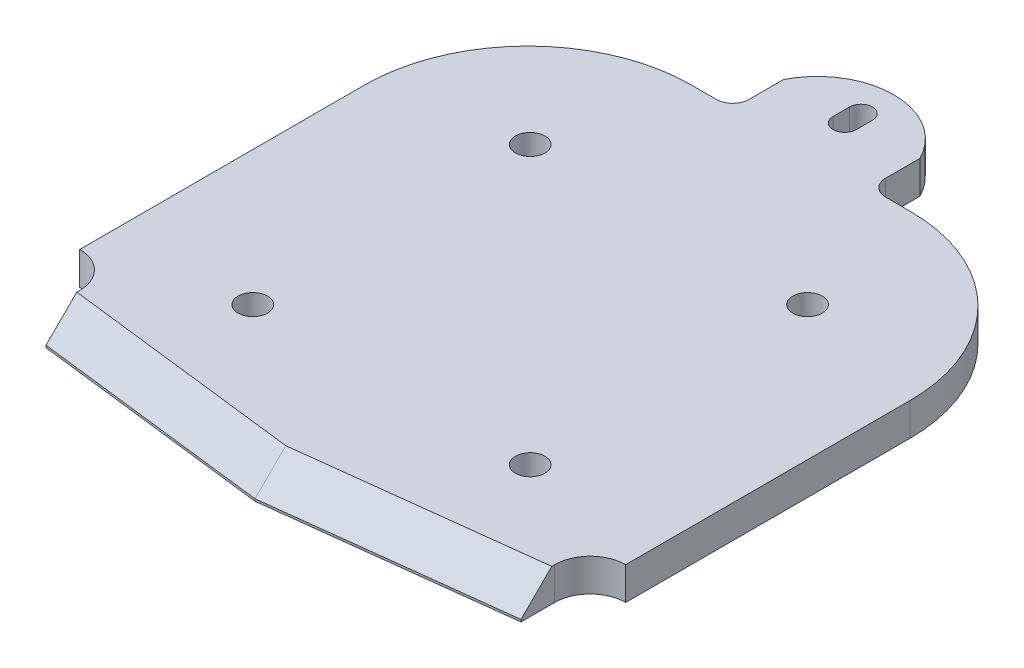
ISO-10303-21;
HEADER;
FILE_DESCRIPTION(('STEP AP214'),'2;1');
FILE_NAME('part.step','',(''),(''),'','','');
FILE_SCHEMA(('AUTOMOTIVE_DESIGN { 1 0 10303 214 1 1 1 1 }'));
ENDSEC;
DATA;
#1=APPLICATION_CONTEXT('core data for automotive mechanical design processes');
#2=APPLICATION_PROTOCOL_DEFINITION('international standard','automotive_design',2000,#1);
#3=PRODUCT_CONTEXT('',#1,'mechanical');
#4=PRODUCT('Part','Part','',(#3));
#5=PRODUCT_RELATED_PRODUCT_CATEGORY('part','',(#4));
#6=PRODUCT_DEFINITION_FORMATION('','',#4);
#7=PRODUCT_DEFINITION_CONTEXT('part definition',#1,'design');
#8=PRODUCT_DEFINITION('design','',#6,#7);
#9=PRODUCT_DEFINITION_SHAPE('','',#8);
#10=(LENGTH_UNIT() NAMED_UNIT(*) SI_UNIT(.MILLI.,.METRE.));
#11=(NAMED_UNIT(*) PLANE_ANGLE_UNIT() SI_UNIT($,.RADIAN.));
#12=(NAMED_UNIT(*) SI_UNIT($,.STERADIAN.) SOLID_ANGLE_UNIT());
#13=UNCERTAINTY_MEASURE_WITH_UNIT(LENGTH_MEASURE(1.E-05),#10,'distance_accuracy_value','');
#14=(GEOMETRIC_REPRESENTATION_CONTEXT(3) GLOBAL_UNCERTAINTY_ASSIGNED_CONTEXT((#13)) GLOBAL_UNIT_ASSIGNED_CONTEXT((#10,
#11,#12)) REPRESENTATION_CONTEXT('',''));
#15=CARTESIAN_POINT('',(0.,0.,0.));
#16=DIRECTION('',(0.,0.,1.));
#17=DIRECTION('',(1.,0.,0.));
#18=AXIS2_PLACEMENT_3D('',#15,#16,#17);
#19=CARTESIAN_POINT('',(0.,6.,0.));
#20=DIRECTION('',(0.119183844208202,0.,0.992872202894086));
#21=DIRECTION('',(0.992872202894086,0.,-0.119183844208202));
#22=AXIS2_PLACEMENT_3D('',#19,#20,#21);
#23=PLANE('',#22);
#24=DIRECTION('',(0.,-1.,0.));
#25=VECTOR('',#24,1.);
#26=CARTESIAN_POINT('',(43.4999999999999,6.,-5.22171655923559));
#27=LINE('',#26,#25);
#28=CARTESIAN_POINT('',(43.4999999999999,0.400000130739457,-5.22171655923559));
#29=VERTEX_POINT('',#28);
#30=CARTESIAN_POINT('',(43.4999999999999,0.,-5.22171655923559));
#31=VERTEX_POINT('',#30);
#32=EDGE_CURVE('E291',#29,#31,#27,.T.);
#33=ORIENTED_EDGE('',*,*,#32,.F.);
#34=DIRECTION('',(-0.992872202894086,0.,0.119183844208202));
#35=VECTOR('',#34,1.);
#36=CARTESIAN_POINT('',(63.1359808294858,0.400000130739457,-7.57880911680247));
#37=LINE('',#36,#35);
#38=CARTESIAN_POINT('',(0.,0.400000130739457,0.));
#39=VERTEX_POINT('',#38);
#40=EDGE_CURVE('E495',#29,#39,#37,.T.);
#41=ORIENTED_EDGE('',*,*,#40,.T.);
#42=DIRECTION('',(0.,-1.,0.));
#43=VECTOR('',#42,1.);
#44=CARTESIAN_POINT('',(0.,6.,0.));
#45=LINE('',#44,#43);
#46=CARTESIAN_POINT('',(0.,0.,0.));
#47=VERTEX_POINT('',#46);
#48=EDGE_CURVE('E293',#39,#47,#45,.T.);
#49=ORIENTED_EDGE('',*,*,#48,.T.);
#50=DIRECTION('',(-0.992872202894086,0.,0.119183844208202));
#51=VECTOR('',#50,1.);
#52=CARTESIAN_POINT('',(0.,0.,0.));
#53=LINE('',#52,#51);
#54=EDGE_CURVE('E229',#31,#47,#53,.T.);
#55=ORIENTED_EDGE('',*,*,#54,.F.);
#56=EDGE_LOOP('',(#33,#41,#49,#55));
#57=FACE_BOUND('',#56,.T.);
#58=ADVANCED_FACE('F34',(#57),#23,.T.);
#59=CARTESIAN_POINT('',(43.4999999999999,6.,0.));
#60=DIRECTION('',(1.,0.,0.));
#61=DIRECTION('',(0.,0.,-1.));
#62=AXIS2_PLACEMENT_3D('',#59,#60,#61);
#63=PLANE('',#62);
#64=DIRECTION('',(0.,0.,1.));
#65=VECTOR('',#64,1.);
#66=CARTESIAN_POINT('',(43.4999999999999,6.,0.));
#67=LINE('',#66,#65);
#68=CARTESIAN_POINT('',(43.4999999999999,6.,-11.4));
#69=VERTEX_POINT('',#68);
#70=CARTESIAN_POINT('',(43.4999999999999,6.,-10.861916801427));
#71=VERTEX_POINT('',#70);
#72=EDGE_CURVE('E329',#69,#71,#67,.T.);
#73=ORIENTED_EDGE('',*,*,#72,.T.);
#74=DIRECTION('',(0.,0.704573320376603,-0.709631197322587));
#75=VECTOR('',#74,1.);
#76=CARTESIAN_POINT('',(43.4999999999999,7.17851612907205,-12.0488930713918));
#77=LINE('',#76,#75);
#78=EDGE_CURVE('E212',#29,#71,#77,.T.);
#79=ORIENTED_EDGE('',*,*,#78,.F.);
#80=ORIENTED_EDGE('',*,*,#32,.T.);
#81=DIRECTION('',(0.,0.,1.));
#82=VECTOR('',#81,1.);
#83=CARTESIAN_POINT('',(43.4999999999999,0.,0.));
#84=LINE('',#83,#82);
#85=CARTESIAN_POINT('',(43.4999999999999,0.,-11.4));
#86=VERTEX_POINT('',#85);
#87=EDGE_CURVE('E232',#86,#31,#84,.T.);
#88=ORIENTED_EDGE('',*,*,#87,.F.);
#89=DIRECTION('',(0.,-1.,0.));
#90=VECTOR('',#89,1.);
#91=CARTESIAN_POINT('',(43.4999999999999,6.,-11.4));
#92=LINE('',#91,#90);
#93=EDGE_CURVE('E289',#69,#86,#92,.T.);
#94=ORIENTED_EDGE('',*,*,#93,.F.);
#95=EDGE_LOOP('',(#73,#79,#80,#88,#94));
#96=FACE_BOUND('',#95,.T.);
#97=ADVANCED_FACE('F371',(#96),#63,.T.);
#98=CARTESIAN_POINT('',(0.,6.,0.));
#99=DIRECTION('',(0.,1.,0.));
#100=DIRECTION('',(0.,0.,1.));
#101=AXIS2_PLACEMENT_3D('',#98,#99,#100);
#102=PLANE('',#101);
#103=CARTESIAN_POINT('',(-25.4,6.,-75.8));
#104=DIRECTION('',(0.,1.,0.));
#105=DIRECTION('',(0.,0.,1.));
#106=AXIS2_PLACEMENT_3D('',#103,#104,#105);
#107=CIRCLE('',#106,2.7051);
#108=CARTESIAN_POINT('',(-25.4,6.,-73.0949));
#109=VERTEX_POINT('',#108);
#110=EDGE_CURVE('E516',#109,#109,#107,.T.);
#111=ORIENTED_EDGE('',*,*,#110,.F.);
#112=EDGE_LOOP('',(#111));
#113=FACE_BOUND('',#112,.T.);
#114=CARTESIAN_POINT('',(25.4,6.,-75.8));
#115=DIRECTION('',(0.,1.,0.));
#116=DIRECTION('',(0.,0.,1.));
#117=AXIS2_PLACEMENT_3D('',#114,#115,#116);
#118=CIRCLE('',#117,2.7051);
#119=CARTESIAN_POINT('',(25.4,6.,-73.0949));
#120=VERTEX_POINT('',#119);
#121=EDGE_CURVE('E520',#120,#120,#118,.T.);
#122=ORIENTED_EDGE('',*,*,#121,.F.);
#123=EDGE_LOOP('',(#122));
#124=FACE_BOUND('',#123,.T.);
#125=CARTESIAN_POINT('',(25.4,6.,-25.));
#126=DIRECTION('',(0.,1.,0.));
#127=DIRECTION('',(0.,0.,1.));
#128=AXIS2_PLACEMENT_3D('',#125,#126,#127);
#129=CIRCLE('',#128,2.7051);
#130=CARTESIAN_POINT('',(25.4,6.,-22.2949));
#131=VERTEX_POINT('',#130);
#132=EDGE_CURVE('E524',#131,#131,#129,.T.);
#133=ORIENTED_EDGE('',*,*,#132,.F.);
#134=EDGE_LOOP('',(#133));
#135=FACE_BOUND('',#134,.T.);
#136=CARTESIAN_POINT('',(-25.4,6.,-25.));
#137=DIRECTION('',(0.,1.,0.));
#138=DIRECTION('',(0.,0.,1.));
#139=AXIS2_PLACEMENT_3D('',#136,#137,#138);
#140=CIRCLE('',#139,2.7051);
#141=CARTESIAN_POINT('',(-25.4,6.,-22.2949));
#142=VERTEX_POINT('',#141);
#143=EDGE_CURVE('E527',#142,#142,#140,.T.);
#144=ORIENTED_EDGE('',*,*,#143,.F.);
#145=EDGE_LOOP('',(#144));
#146=FACE_BOUND('',#145,.T.);
#147=DIRECTION('',(0.992872202894086,0.,0.119183844208201));
#148=VECTOR('',#147,1.);
#149=CARTESIAN_POINT('',(-63.1359808294858,6.,-13.2190093589938));
#150=LINE('',#149,#148);
#151=CARTESIAN_POINT('',(-43.5,6.,-10.8619168014269));
#152=VERTEX_POINT('',#151);
#153=CARTESIAN_POINT('',(0.,6.,-5.64020024219136));
#154=VERTEX_POINT('',#153);
#155=EDGE_CURVE('E472',#152,#154,#150,.T.);
#156=ORIENTED_EDGE('',*,*,#155,.T.);
#157=DIRECTION('',(-0.992872202894086,0.,0.119183844208202));
#158=VECTOR('',#157,1.);
#159=CARTESIAN_POINT('',(63.1359808294858,6.,-13.2190093589938));
#160=LINE('',#159,#158);
#161=EDGE_CURVE('E454',#71,#154,#160,.T.);
#162=ORIENTED_EDGE('',*,*,#161,.F.);
#163=ORIENTED_EDGE('',*,*,#72,.F.);
#164=CARTESIAN_POINT('',(50.,6.,-11.4));
#165=DIRECTION('',(0.,1.,0.));
#166=DIRECTION('',(0.,0.,1.));
#167=AXIS2_PLACEMENT_3D('',#164,#165,#166);
#168=CIRCLE('',#167,6.5000000000001);
#169=CARTESIAN_POINT('',(50.,6.,-17.9000000000001));
#170=VERTEX_POINT('',#169);
#171=EDGE_CURVE('E332',#170,#69,#168,.T.);
#172=ORIENTED_EDGE('',*,*,#171,.F.);
#173=DIRECTION('',(0.,0.,1.));
#174=VECTOR('',#173,1.);
#175=CARTESIAN_POINT('',(50.,6.,0.));
#176=LINE('',#175,#174);
#177=CARTESIAN_POINT('',(50.,6.,-70.));
#178=VERTEX_POINT('',#177);
#179=EDGE_CURVE('E335',#178,#170,#176,.T.);
#180=ORIENTED_EDGE('',*,*,#179,.F.);
#181=CARTESIAN_POINT('',(20.,6.,-70.));
#182=DIRECTION('',(0.,1.,0.));
#183=DIRECTION('',(0.,0.,1.));
#184=AXIS2_PLACEMENT_3D('',#181,#182,#183);
#185=CIRCLE('',#184,30.);
#186=CARTESIAN_POINT('',(20.,6.,-100.));
#187=VERTEX_POINT('',#186);
#188=EDGE_CURVE('E338',#178,#187,#185,.T.);
#189=ORIENTED_EDGE('',*,*,#188,.T.);
#190=DIRECTION('',(1.,0.,0.));
#191=VECTOR('',#190,1.);
#192=CARTESIAN_POINT('',(-3.08395284618099E-13,6.,-100.));
#193=LINE('',#192,#191);
#194=CARTESIAN_POINT('',(15.5,6.,-100.));
#195=VERTEX_POINT('',#194);
#196=EDGE_CURVE('E340',#195,#187,#193,.T.);
#197=ORIENTED_EDGE('',*,*,#196,.F.);
#198=CARTESIAN_POINT('',(15.5,6.,-103.));
#199=DIRECTION('',(0.,1.,0.));
#200=DIRECTION('',(0.,0.,1.));
#201=AXIS2_PLACEMENT_3D('',#198,#199,#200);
#202=CIRCLE('',#201,3.);
#203=CARTESIAN_POINT('',(12.5,6.,-103.));
#204=VERTEX_POINT('',#203);
#205=EDGE_CURVE('E343',#204,#195,#202,.T.);
#206=ORIENTED_EDGE('',*,*,#205,.F.);
#207=DIRECTION('',(0.,0.,-1.));
#208=VECTOR('',#207,1.);
#209=CARTESIAN_POINT('',(12.5000000000001,6.,0.));
#210=LINE('',#209,#208);
#211=CARTESIAN_POINT('',(12.5,6.,-109.304760106459));
#212=VERTEX_POINT('',#211);
#213=EDGE_CURVE('E346',#204,#212,#210,.T.);
#214=ORIENTED_EDGE('',*,*,#213,.T.);
#215=CARTESIAN_POINT('',(0.,6.,-103.));
#216=DIRECTION('',(0.,1.,0.));
#217=DIRECTION('',(0.,0.,1.));
#218=AXIS2_PLACEMENT_3D('',#215,#216,#217);
#219=CIRCLE('',#218,14.);
#220=CARTESIAN_POINT('',(-12.5,6.,-109.304760106459));
#221=VERTEX_POINT('',#220);
#222=EDGE_CURVE('E349',#212,#221,#219,.T.);
#223=ORIENTED_EDGE('',*,*,#222,.T.);
#224=DIRECTION('',(0.,0.,-1.));
#225=VECTOR('',#224,1.);
#226=CARTESIAN_POINT('',(-12.5,6.,0.));
#227=LINE('',#226,#225);
#228=CARTESIAN_POINT('',(-12.5,6.,-103.));
#229=VERTEX_POINT('',#228);
#230=EDGE_CURVE('E351',#229,#221,#227,.T.);
#231=ORIENTED_EDGE('',*,*,#230,.F.);
#232=CARTESIAN_POINT('',(-15.5,6.,-103.));
#233=DIRECTION('',(0.,1.,0.));
#234=DIRECTION('',(0.,0.,1.));
#235=AXIS2_PLACEMENT_3D('',#232,#233,#234);
#236=CIRCLE('',#235,3.);
#237=CARTESIAN_POINT('',(-15.5,6.,-100.));
#238=VERTEX_POINT('',#237);
#239=EDGE_CURVE('E199',#238,#229,#236,.T.);
#240=ORIENTED_EDGE('',*,*,#239,.F.);
#241=DIRECTION('',(1.,0.,0.));
#242=VECTOR('',#241,1.);
#243=CARTESIAN_POINT('',(-3.08395284618099E-13,6.,-100.));
#244=LINE('',#243,#242);
#245=CARTESIAN_POINT('',(-20.,6.,-100.));
#246=VERTEX_POINT('',#245);
#247=EDGE_CURVE('E181',#246,#238,#244,.T.);
#248=ORIENTED_EDGE('',*,*,#247,.F.);
#249=CARTESIAN_POINT('',(-20.,6.,-70.));
#250=DIRECTION('',(0.,1.,0.));
#251=DIRECTION('',(0.,0.,1.));
#252=AXIS2_PLACEMENT_3D('',#249,#250,#251);
#253=CIRCLE('',#252,30.);
#254=CARTESIAN_POINT('',(-50.,6.,-70.));
#255=VERTEX_POINT('',#254);
#256=EDGE_CURVE('E196',#255,#246,#253,.F.);
#257=ORIENTED_EDGE('',*,*,#256,.F.);
#258=DIRECTION('',(0.,0.,-1.));
#259=VECTOR('',#258,1.);
#260=CARTESIAN_POINT('',(-50.,6.,0.));
#261=LINE('',#260,#259);
#262=CARTESIAN_POINT('',(-50.,6.,-17.9));
#263=VERTEX_POINT('',#262);
#264=EDGE_CURVE('E202',#263,#255,#261,.T.);
#265=ORIENTED_EDGE('',*,*,#264,.F.);
#266=CARTESIAN_POINT('',(-50.,6.,-11.4));
#267=DIRECTION('',(0.,1.,0.));
#268=DIRECTION('',(0.,0.,1.));
#269=AXIS2_PLACEMENT_3D('',#266,#267,#268);
#270=CIRCLE('',#269,6.49999999999997);
#271=CARTESIAN_POINT('',(-43.5,6.,-11.4));
#272=VERTEX_POINT('',#271);
#273=EDGE_CURVE('E320',#272,#263,#270,.T.);
#274=ORIENTED_EDGE('',*,*,#273,.F.);
#275=DIRECTION('',(0.,0.,-1.));
#276=VECTOR('',#275,1.);
#277=CARTESIAN_POINT('',(-43.5,6.,0.));
#278=LINE('',#277,#276);
#279=EDGE_CURVE('E327',#152,#272,#278,.T.);
#280=ORIENTED_EDGE('',*,*,#279,.F.);
#281=EDGE_LOOP('',(#156,#162,#163,#172,#180,#189,#197,#206,#214,#223,#231,#240,#248,#257,#265,
#274,#280));
#282=FACE_BOUND('',#281,.T.);
#283=CARTESIAN_POINT('',(0.,6.,-111.));
#284=DIRECTION('',(0.,1.,0.));
#285=DIRECTION('',(0.,0.,1.));
#286=AXIS2_PLACEMENT_3D('',#283,#284,#285);
#287=CIRCLE('',#286,2.1);
#288=CARTESIAN_POINT('',(2.1,6.,-111.));
#289=VERTEX_POINT('',#288);
#290=CARTESIAN_POINT('',(-2.1,6.,-111.));
#291=VERTEX_POINT('',#290);
#292=EDGE_CURVE('E268',#289,#291,#287,.T.);
#293=ORIENTED_EDGE('',*,*,#292,.F.);
#294=DIRECTION('',(0.,0.,-1.));
#295=VECTOR('',#294,1.);
#296=CARTESIAN_POINT('',(2.10000000000002,6.,0.));
#297=LINE('',#296,#295);
#298=CARTESIAN_POINT('',(2.1,6.,-108.));
#299=VERTEX_POINT('',#298);
#300=EDGE_CURVE('E307',#299,#289,#297,.T.);
#301=ORIENTED_EDGE('',*,*,#300,.F.);
#302=CARTESIAN_POINT('',(0.,6.,-108.));
#303=DIRECTION('',(0.,1.,0.));
#304=DIRECTION('',(0.,0.,1.));
#305=AXIS2_PLACEMENT_3D('',#302,#303,#304);
#306=CIRCLE('',#305,2.1);
#307=CARTESIAN_POINT('',(-2.1,6.,-108.));
#308=VERTEX_POINT('',#307);
#309=EDGE_CURVE('E316',#308,#299,#306,.T.);
#310=ORIENTED_EDGE('',*,*,#309,.F.);
#311=DIRECTION('',(0.,0.,-1.));
#312=VECTOR('',#311,1.);
#313=CARTESIAN_POINT('',(-2.09999999999998,6.,0.));
#314=LINE('',#313,#312);
#315=EDGE_CURVE('E318',#308,#291,#314,.T.);
#316=ORIENTED_EDGE('',*,*,#315,.T.);
#317=EDGE_LOOP('',(#293,#301,#310,#316));
#318=FACE_BOUND('',#317,.T.);
#319=ADVANCED_FACE('F193',(#113,#124,#135,#146,#282,#318),#102,.T.);
#320=CARTESIAN_POINT('',(-50.,6.,-11.4));
#321=DIRECTION('',(0.,-1.,0.));
#322=DIRECTION('',(0.,0.,-1.));
#323=AXIS2_PLACEMENT_3D('',#320,#321,#322);
#324=CYLINDRICAL_SURFACE('',#323,6.49999999999997);
#325=CARTESIAN_POINT('',(-50.,0.,-11.4));
#326=DIRECTION('',(0.,1.,0.));
#327=DIRECTION('',(0.,0.,1.));
#328=AXIS2_PLACEMENT_3D('',#325,#326,#327);
#329=CIRCLE('',#328,6.49999999999997);
#330=CARTESIAN_POINT('',(-43.5,0.,-11.4));
#331=VERTEX_POINT('',#330);
#332=CARTESIAN_POINT('',(-50.,0.,-17.9));
#333=VERTEX_POINT('',#332);
#334=EDGE_CURVE('E221',#331,#333,#329,.T.);
#335=ORIENTED_EDGE('',*,*,#334,.F.);
#336=DIRECTION('',(0.,-1.,0.));
#337=VECTOR('',#336,1.);
#338=CARTESIAN_POINT('',(-43.5,6.,-11.4));
#339=LINE('',#338,#337);
#340=EDGE_CURVE('E11',#272,#331,#339,.T.);
#341=ORIENTED_EDGE('',*,*,#340,.F.);
#342=ORIENTED_EDGE('',*,*,#273,.T.);
#343=DIRECTION('',(0.,-1.,0.));
#344=VECTOR('',#343,1.);
#345=CARTESIAN_POINT('',(-50.,6.,-17.9));
#346=LINE('',#345,#344);
#347=EDGE_CURVE('E53',#263,#333,#346,.T.);
#348=ORIENTED_EDGE('',*,*,#347,.T.);
#349=EDGE_LOOP('',(#335,#341,#342,#348));
#350=FACE_BOUND('',#349,.T.);
#351=ADVANCED_FACE('F390',(#350),#324,.F.);
#352=CARTESIAN_POINT('',(-43.5,6.,0.));
#353=DIRECTION('',(-1.,0.,0.));
#354=DIRECTION('',(0.,0.,1.));
#355=AXIS2_PLACEMENT_3D('',#352,#353,#354);
#356=PLANE('',#355);
#357=DIRECTION('',(0.,0.704573320376603,-0.709631197322587));
#358=VECTOR('',#357,1.);
#359=CARTESIAN_POINT('',(-43.5,7.17851612907204,-12.0488930713918));
#360=LINE('',#359,#358);
#361=CARTESIAN_POINT('',(-43.5,0.400000130739457,-5.22171655923559));
#362=VERTEX_POINT('',#361);
#363=EDGE_CURVE('E475',#362,#152,#360,.T.);
#364=ORIENTED_EDGE('',*,*,#363,.T.);
#365=ORIENTED_EDGE('',*,*,#279,.T.);
#366=ORIENTED_EDGE('',*,*,#340,.T.);
#367=DIRECTION('',(0.,0.,-1.));
#368=VECTOR('',#367,1.);
#369=CARTESIAN_POINT('',(-43.5,0.,0.));
#370=LINE('',#369,#368);
#371=CARTESIAN_POINT('',(-43.5,0.,-5.22171655923559));
#372=VERTEX_POINT('',#371);
#373=EDGE_CURVE('E223',#372,#331,#370,.T.);
#374=ORIENTED_EDGE('',*,*,#373,.F.);
#375=DIRECTION('',(0.,-1.,0.));
#376=VECTOR('',#375,1.);
#377=CARTESIAN_POINT('',(-43.5,6.,-5.22171655923559));
#378=LINE('',#377,#376);
#379=EDGE_CURVE('E44',#362,#372,#378,.T.);
#380=ORIENTED_EDGE('',*,*,#379,.F.);
#381=EDGE_LOOP('',(#364,#365,#366,#374,#380));
#382=FACE_BOUND('',#381,.T.);
#383=ADVANCED_FACE('F387',(#382),#356,.T.);
#384=CARTESIAN_POINT('',(0.,6.,0.));
#385=DIRECTION('',(-0.119183844208201,0.,0.992872202894086));
#386=DIRECTION('',(0.992872202894086,0.,0.119183844208201));
#387=AXIS2_PLACEMENT_3D('',#384,#385,#386);
#388=PLANE('',#387);
#389=DIRECTION('',(0.992872202894086,0.,0.119183844208201));
#390=VECTOR('',#389,1.);
#391=CARTESIAN_POINT('',(-63.1359808294858,0.400000130739457,-7.57880911680244));
#392=LINE('',#391,#390);
#393=EDGE_CURVE('E480',#362,#39,#392,.T.);
#394=ORIENTED_EDGE('',*,*,#393,.F.);
#395=ORIENTED_EDGE('',*,*,#379,.T.);
#396=DIRECTION('',(-0.992872202894086,0.,-0.119183844208201));
#397=VECTOR('',#396,1.);
#398=CARTESIAN_POINT('',(0.,0.,0.));
#399=LINE('',#398,#397);
#400=EDGE_CURVE('E226',#47,#372,#399,.T.);
#401=ORIENTED_EDGE('',*,*,#400,.F.);
#402=ORIENTED_EDGE('',*,*,#48,.F.);
#403=EDGE_LOOP('',(#394,#395,#401,#402));
#404=FACE_BOUND('',#403,.T.);
#405=ADVANCED_FACE('F383',(#404),#388,.T.);
#406=CARTESIAN_POINT('',(50.,6.,-11.4));
#407=DIRECTION('',(0.,-1.,0.));
#408=DIRECTION('',(0.,0.,-1.));
#409=AXIS2_PLACEMENT_3D('',#406,#407,#408);
#410=CYLINDRICAL_SURFACE('',#409,6.5000000000001);
#411=CARTESIAN_POINT('',(50.,0.,-11.4));
#412=DIRECTION('',(0.,1.,0.));
#413=DIRECTION('',(0.,0.,1.));
#414=AXIS2_PLACEMENT_3D('',#411,#412,#413);
#415=CIRCLE('',#414,6.5000000000001);
#416=CARTESIAN_POINT('',(50.,0.,-17.9000000000001));
#417=VERTEX_POINT('',#416);
#418=EDGE_CURVE('E235',#417,#86,#415,.T.);
#419=ORIENTED_EDGE('',*,*,#418,.F.);
#420=DIRECTION('',(0.,-1.,0.));
#421=VECTOR('',#420,1.);
#422=CARTESIAN_POINT('',(50.,6.,-17.9000000000001));
#423=LINE('',#422,#421);
#424=EDGE_CURVE('E287',#170,#417,#423,.T.);
#425=ORIENTED_EDGE('',*,*,#424,.F.);
#426=ORIENTED_EDGE('',*,*,#171,.T.);
#427=ORIENTED_EDGE('',*,*,#93,.T.);
#428=EDGE_LOOP('',(#419,#425,#426,#427));
#429=FACE_BOUND('',#428,.T.);
#430=ADVANCED_FACE('F386',(#429),#410,.F.);
#431=CARTESIAN_POINT('',(50.,6.,0.));
#432=DIRECTION('',(1.,0.,0.));
#433=DIRECTION('',(0.,0.,-1.));
#434=AXIS2_PLACEMENT_3D('',#431,#432,#433);
#435=PLANE('',#434);
#436=DIRECTION('',(0.,0.,1.));
#437=VECTOR('',#436,1.);
#438=CARTESIAN_POINT('',(50.,0.,0.));
#439=LINE('',#438,#437);
#440=CARTESIAN_POINT('',(50.,0.,-70.));
#441=VERTEX_POINT('',#440);
#442=EDGE_CURVE('E238',#441,#417,#439,.T.);
#443=ORIENTED_EDGE('',*,*,#442,.F.);
#444=DIRECTION('',(0.,-1.,0.));
#445=VECTOR('',#444,1.);
#446=CARTESIAN_POINT('',(50.,6.,-70.));
#447=LINE('',#446,#445);
#448=EDGE_CURVE('E285',#178,#441,#447,.T.);
#449=ORIENTED_EDGE('',*,*,#448,.F.);
#450=ORIENTED_EDGE('',*,*,#179,.T.);
#451=ORIENTED_EDGE('',*,*,#424,.T.);
#452=EDGE_LOOP('',(#443,#449,#450,#451));
#453=FACE_BOUND('',#452,.T.);
#454=ADVANCED_FACE('F432',(#453),#435,.T.);
#455=CARTESIAN_POINT('',(20.,6.,-70.));
#456=DIRECTION('',(0.,-1.,0.));
#457=DIRECTION('',(0.,0.,-1.));
#458=AXIS2_PLACEMENT_3D('',#455,#456,#457);
#459=CYLINDRICAL_SURFACE('',#458,30.);
#460=CARTESIAN_POINT('',(20.,0.,-70.));
#461=DIRECTION('',(0.,1.,0.));
#462=DIRECTION('',(0.,0.,1.));
#463=AXIS2_PLACEMENT_3D('',#460,#461,#462);
#464=CIRCLE('',#463,30.);
#465=CARTESIAN_POINT('',(20.,0.,-100.));
#466=VERTEX_POINT('',#465);
#467=EDGE_CURVE('E241',#441,#466,#464,.T.);
#468=ORIENTED_EDGE('',*,*,#467,.T.);
#469=DIRECTION('',(0.,-1.,0.));
#470=VECTOR('',#469,1.);
#471=CARTESIAN_POINT('',(20.,6.,-100.));
#472=LINE('',#471,#470);
#473=EDGE_CURVE('E283',#187,#466,#472,.T.);
#474=ORIENTED_EDGE('',*,*,#473,.F.);
#475=ORIENTED_EDGE('',*,*,#188,.F.);
#476=ORIENTED_EDGE('',*,*,#448,.T.);
#477=EDGE_LOOP('',(#468,#474,#475,#476));
#478=FACE_BOUND('',#477,.T.);
#479=ADVANCED_FACE('F428',(#478),#459,.T.);
#480=CARTESIAN_POINT('',(-3.08395284618099E-13,6.,-100.));
#481=DIRECTION('',(0.,0.,-1.));
#482=DIRECTION('',(-1.,0.,0.));
#483=AXIS2_PLACEMENT_3D('',#480,#481,#482);
#484=PLANE('',#483);
#485=DIRECTION('',(1.,0.,0.));
#486=VECTOR('',#485,1.);
#487=CARTESIAN_POINT('',(-3.08395284618099E-13,0.,-100.));
#488=LINE('',#487,#486);
#489=CARTESIAN_POINT('',(15.5,0.,-100.));
#490=VERTEX_POINT('',#489);
#491=EDGE_CURVE('E244',#490,#466,#488,.T.);
#492=ORIENTED_EDGE('',*,*,#491,.F.);
#493=DIRECTION('',(0.,-1.,0.));
#494=VECTOR('',#493,1.);
#495=CARTESIAN_POINT('',(15.5,6.,-100.));
#496=LINE('',#495,#494);
#497=EDGE_CURVE('E281',#195,#490,#496,.T.);
#498=ORIENTED_EDGE('',*,*,#497,.F.);
#499=ORIENTED_EDGE('',*,*,#196,.T.);
#500=ORIENTED_EDGE('',*,*,#473,.T.);
#501=EDGE_LOOP('',(#492,#498,#499,#500));
#502=FACE_BOUND('',#501,.T.);
#503=ADVANCED_FACE('F424',(#502),#484,.T.);
#504=CARTESIAN_POINT('',(15.5,6.,-103.));
#505=DIRECTION('',(0.,-1.,0.));
#506=DIRECTION('',(0.,0.,-1.));
#507=AXIS2_PLACEMENT_3D('',#504,#505,#506);
#508=CYLINDRICAL_SURFACE('',#507,3.);
#509=CARTESIAN_POINT('',(15.5,0.,-103.));
#510=DIRECTION('',(0.,1.,0.));
#511=DIRECTION('',(0.,0.,1.));
#512=AXIS2_PLACEMENT_3D('',#509,#510,#511);
#513=CIRCLE('',#512,3.);
#514=CARTESIAN_POINT('',(12.5,0.,-103.));
#515=VERTEX_POINT('',#514);
#516=EDGE_CURVE('E247',#515,#490,#513,.T.);
#517=ORIENTED_EDGE('',*,*,#516,.F.);
#518=DIRECTION('',(0.,-1.,0.));
#519=VECTOR('',#518,1.);
#520=CARTESIAN_POINT('',(12.5,6.,-103.));
#521=LINE('',#520,#519);
#522=EDGE_CURVE('E279',#204,#515,#521,.T.);
#523=ORIENTED_EDGE('',*,*,#522,.F.);
#524=ORIENTED_EDGE('',*,*,#205,.T.);
#525=ORIENTED_EDGE('',*,*,#497,.T.);
#526=EDGE_LOOP('',(#517,#523,#524,#525));
#527=FACE_BOUND('',#526,.T.);
#528=ADVANCED_FACE('F420',(#527),#508,.F.);
#529=CARTESIAN_POINT('',(12.5000000000001,6.,0.));
#530=DIRECTION('',(-1.,0.,0.));
#531=DIRECTION('',(0.,0.,1.));
#532=AXIS2_PLACEMENT_3D('',#529,#530,#531);
#533=PLANE('',#532);
#534=DIRECTION('',(0.,0.,-1.));
#535=VECTOR('',#534,1.);
#536=CARTESIAN_POINT('',(12.5000000000001,0.,0.));
#537=LINE('',#536,#535);
#538=CARTESIAN_POINT('',(12.5,0.,-109.304760106459));
#539=VERTEX_POINT('',#538);
#540=EDGE_CURVE('E250',#515,#539,#537,.T.);
#541=ORIENTED_EDGE('',*,*,#540,.T.);
#542=DIRECTION('',(0.,-1.,0.));
#543=VECTOR('',#542,1.);
#544=CARTESIAN_POINT('',(12.5,6.,-109.304760106459));
#545=LINE('',#544,#543);
#546=EDGE_CURVE('E276',#212,#539,#545,.T.);
#547=ORIENTED_EDGE('',*,*,#546,.F.);
#548=ORIENTED_EDGE('',*,*,#213,.F.);
#549=ORIENTED_EDGE('',*,*,#522,.T.);
#550=EDGE_LOOP('',(#541,#547,#548,#549));
#551=FACE_BOUND('',#550,.T.);
#552=ADVANCED_FACE('F416',(#551),#533,.F.);
#553=CARTESIAN_POINT('',(0.,6.,-103.));
#554=DIRECTION('',(0.,-1.,0.));
#555=DIRECTION('',(0.,0.,-1.));
#556=AXIS2_PLACEMENT_3D('',#553,#554,#555);
#557=CYLINDRICAL_SURFACE('',#556,14.);
#558=CARTESIAN_POINT('',(0.,0.,-103.));
#559=DIRECTION('',(0.,1.,0.));
#560=DIRECTION('',(0.,0.,1.));
#561=AXIS2_PLACEMENT_3D('',#558,#559,#560);
#562=CIRCLE('',#561,14.);
#563=CARTESIAN_POINT('',(-12.5,0.,-109.304760106459));
#564=VERTEX_POINT('',#563);
#565=EDGE_CURVE('E253',#539,#564,#562,.T.);
#566=ORIENTED_EDGE('',*,*,#565,.T.);
#567=DIRECTION('',(0.,-1.,0.));
#568=VECTOR('',#567,1.);
#569=CARTESIAN_POINT('',(-12.5,6.,-109.304760106459));
#570=LINE('',#569,#568);
#571=EDGE_CURVE('E274',#221,#564,#570,.T.);
#572=ORIENTED_EDGE('',*,*,#571,.F.);
#573=ORIENTED_EDGE('',*,*,#222,.F.);
#574=ORIENTED_EDGE('',*,*,#546,.T.);
#575=EDGE_LOOP('',(#566,#572,#573,#574));
#576=FACE_BOUND('',#575,.T.);
#577=ADVANCED_FACE('F412',(#576),#557,.T.);
#578=CARTESIAN_POINT('',(-12.5,6.,0.));
#579=DIRECTION('',(-1.,0.,0.));
#580=DIRECTION('',(0.,0.,1.));
#581=AXIS2_PLACEMENT_3D('',#578,#579,#580);
#582=PLANE('',#581);
#583=DIRECTION('',(0.,0.,-1.));
#584=VECTOR('',#583,1.);
#585=CARTESIAN_POINT('',(-12.5,0.,0.));
#586=LINE('',#585,#584);
#587=CARTESIAN_POINT('',(-12.5,0.,-103.));
#588=VERTEX_POINT('',#587);
#589=EDGE_CURVE('E256',#588,#564,#586,.T.);
#590=ORIENTED_EDGE('',*,*,#589,.F.);
#591=DIRECTION('',(0.,-1.,0.));
#592=VECTOR('',#591,1.);
#593=CARTESIAN_POINT('',(-12.5,6.,-103.));
#594=LINE('',#593,#592);
#595=EDGE_CURVE('E272',#229,#588,#594,.T.);
#596=ORIENTED_EDGE('',*,*,#595,.F.);
#597=ORIENTED_EDGE('',*,*,#230,.T.);
#598=ORIENTED_EDGE('',*,*,#571,.T.);
#599=EDGE_LOOP('',(#590,#596,#597,#598));
#600=FACE_BOUND('',#599,.T.);
#601=ADVANCED_FACE('F409',(#600),#582,.T.);
#602=CARTESIAN_POINT('',(-15.5,6.,-103.));
#603=DIRECTION('',(0.,-1.,0.));
#604=DIRECTION('',(0.,0.,-1.));
#605=AXIS2_PLACEMENT_3D('',#602,#603,#604);
#606=CYLINDRICAL_SURFACE('',#605,3.);
#607=CARTESIAN_POINT('',(-15.5,0.,-103.));
#608=DIRECTION('',(0.,1.,0.));
#609=DIRECTION('',(0.,0.,1.));
#610=AXIS2_PLACEMENT_3D('',#607,#608,#609);
#611=CIRCLE('',#610,3.);
#612=CARTESIAN_POINT('',(-15.5,0.,-100.));
#613=VERTEX_POINT('',#612);
#614=EDGE_CURVE('E259',#613,#588,#611,.T.);
#615=ORIENTED_EDGE('',*,*,#614,.F.);
#616=DIRECTION('',(0.,-1.,0.));
#617=VECTOR('',#616,1.);
#618=CARTESIAN_POINT('',(-15.5,6.,-100.));
#619=LINE('',#618,#617);
#620=EDGE_CURVE('E187',#238,#613,#619,.T.);
#621=ORIENTED_EDGE('',*,*,#620,.F.);
#622=ORIENTED_EDGE('',*,*,#239,.T.);
#623=ORIENTED_EDGE('',*,*,#595,.T.);
#624=EDGE_LOOP('',(#615,#621,#622,#623));
#625=FACE_BOUND('',#624,.T.);
#626=ADVANCED_FACE('F355',(#625),#606,.F.);
#627=CARTESIAN_POINT('',(-3.08395284618099E-13,6.,-100.));
#628=DIRECTION('',(0.,0.,-1.));
#629=DIRECTION('',(-1.,0.,0.));
#630=AXIS2_PLACEMENT_3D('',#627,#628,#629);
#631=PLANE('',#630);
#632=DIRECTION('',(1.,0.,0.));
#633=VECTOR('',#632,1.);
#634=CARTESIAN_POINT('',(-3.08395284618099E-13,0.,-100.));
#635=LINE('',#634,#633);
#636=CARTESIAN_POINT('',(-20.,0.,-100.));
#637=VERTEX_POINT('',#636);
#638=EDGE_CURVE('E183',#637,#613,#635,.T.);
#639=ORIENTED_EDGE('',*,*,#638,.F.);
#640=DIRECTION('',(0.,-1.,0.));
#641=VECTOR('',#640,1.);
#642=CARTESIAN_POINT('',(-20.,6.,-100.));
#643=LINE('',#642,#641);
#644=EDGE_CURVE('E178',#246,#637,#643,.T.);
#645=ORIENTED_EDGE('',*,*,#644,.F.);
#646=ORIENTED_EDGE('',*,*,#247,.T.);
#647=ORIENTED_EDGE('',*,*,#620,.T.);
#648=EDGE_LOOP('',(#639,#645,#646,#647));
#649=FACE_BOUND('',#648,.T.);
#650=ADVANCED_FACE('F180',(#649),#631,.T.);
#651=CARTESIAN_POINT('',(-20.,6.,-70.));
#652=DIRECTION('',(0.,-1.,0.));
#653=DIRECTION('',(0.,0.,-1.));
#654=AXIS2_PLACEMENT_3D('',#651,#652,#653);
#655=CYLINDRICAL_SURFACE('',#654,30.);
#656=CARTESIAN_POINT('',(-20.,0.,-70.));
#657=DIRECTION('',(0.,1.,0.));
#658=DIRECTION('',(0.,0.,1.));
#659=AXIS2_PLACEMENT_3D('',#656,#657,#658);
#660=CIRCLE('',#659,30.);
#661=CARTESIAN_POINT('',(-50.,0.,-70.));
#662=VERTEX_POINT('',#661);
#663=EDGE_CURVE('E263',#662,#637,#660,.F.);
#664=ORIENTED_EDGE('',*,*,#663,.F.);
#665=DIRECTION('',(0.,-1.,0.));
#666=VECTOR('',#665,1.);
#667=CARTESIAN_POINT('',(-50.,6.,-70.));
#668=LINE('',#667,#666);
#669=EDGE_CURVE('E118',#255,#662,#668,.T.);
#670=ORIENTED_EDGE('',*,*,#669,.F.);
#671=ORIENTED_EDGE('',*,*,#256,.T.);
#672=ORIENTED_EDGE('',*,*,#644,.T.);
#673=EDGE_LOOP('',(#664,#670,#671,#672));
#674=FACE_BOUND('',#673,.T.);
#675=ADVANCED_FACE('F201',(#674),#655,.T.);
#676=CARTESIAN_POINT('',(0.,6.,-111.));
#677=DIRECTION('',(0.,-1.,0.));
#678=DIRECTION('',(0.,0.,-1.));
#679=AXIS2_PLACEMENT_3D('',#676,#677,#678);
#680=CYLINDRICAL_SURFACE('',#679,2.1);
#681=CARTESIAN_POINT('',(0.,0.,-111.));
#682=DIRECTION('',(0.,1.,0.));
#683=DIRECTION('',(0.,0.,1.));
#684=AXIS2_PLACEMENT_3D('',#681,#682,#683);
#685=CIRCLE('',#684,2.1);
#686=CARTESIAN_POINT('',(2.1,0.,-111.));
#687=VERTEX_POINT('',#686);
#688=CARTESIAN_POINT('',(-2.1,0.,-111.));
#689=VERTEX_POINT('',#688);
#690=EDGE_CURVE('E208',#687,#689,#685,.T.);
#691=ORIENTED_EDGE('',*,*,#690,.F.);
#692=DIRECTION('',(0.,-1.,0.));
#693=VECTOR('',#692,1.);
#694=CARTESIAN_POINT('',(2.1,6.,-111.));
#695=LINE('',#694,#693);
#696=EDGE_CURVE('E38',#289,#687,#695,.T.);
#697=ORIENTED_EDGE('',*,*,#696,.F.);
#698=ORIENTED_EDGE('',*,*,#292,.T.);
#699=DIRECTION('',(0.,-1.,0.));
#700=VECTOR('',#699,1.);
#701=CARTESIAN_POINT('',(-2.1,6.,-111.));
#702=LINE('',#701,#700);
#703=EDGE_CURVE('E204',#291,#689,#702,.T.);
#704=ORIENTED_EDGE('',*,*,#703,.T.);
#705=EDGE_LOOP('',(#691,#697,#698,#704));
#706=FACE_BOUND('',#705,.T.);
#707=ADVANCED_FACE('F36',(#706),#680,.F.);
#708=CARTESIAN_POINT('',(2.10000000000002,6.,0.));
#709=DIRECTION('',(-1.,0.,0.));
#710=DIRECTION('',(0.,0.,1.));
#711=AXIS2_PLACEMENT_3D('',#708,#709,#710);
#712=PLANE('',#711);
#713=DIRECTION('',(0.,0.,-1.));
#714=VECTOR('',#713,1.);
#715=CARTESIAN_POINT('',(2.10000000000002,0.,0.));
#716=LINE('',#715,#714);
#717=CARTESIAN_POINT('',(2.1,0.,-108.));
#718=VERTEX_POINT('',#717);
#719=EDGE_CURVE('E211',#718,#687,#716,.T.);
#720=ORIENTED_EDGE('',*,*,#719,.F.);
#721=DIRECTION('',(0.,-1.,0.));
#722=VECTOR('',#721,1.);
#723=CARTESIAN_POINT('',(2.1,6.,-108.));
#724=LINE('',#723,#722);
#725=EDGE_CURVE('E298',#299,#718,#724,.T.);
#726=ORIENTED_EDGE('',*,*,#725,.F.);
#727=ORIENTED_EDGE('',*,*,#300,.T.);
#728=ORIENTED_EDGE('',*,*,#696,.T.);
#729=EDGE_LOOP('',(#720,#726,#727,#728));
#730=FACE_BOUND('',#729,.T.);
#731=ADVANCED_FACE('F305',(#730),#712,.T.);
#732=CARTESIAN_POINT('',(0.,6.,-108.));
#733=DIRECTION('',(0.,-1.,0.));
#734=DIRECTION('',(0.,0.,-1.));
#735=AXIS2_PLACEMENT_3D('',#732,#733,#734);
#736=CYLINDRICAL_SURFACE('',#735,2.1);
#737=CARTESIAN_POINT('',(0.,0.,-108.));
#738=DIRECTION('',(0.,1.,0.));
#739=DIRECTION('',(0.,0.,1.));
#740=AXIS2_PLACEMENT_3D('',#737,#738,#739);
#741=CIRCLE('',#740,2.1);
#742=CARTESIAN_POINT('',(-2.1,0.,-108.));
#743=VERTEX_POINT('',#742);
#744=EDGE_CURVE('E215',#743,#718,#741,.T.);
#745=ORIENTED_EDGE('',*,*,#744,.F.);
#746=DIRECTION('',(0.,-1.,0.));
#747=VECTOR('',#746,1.);
#748=CARTESIAN_POINT('',(-2.1,6.,-108.));
#749=LINE('',#748,#747);
#750=EDGE_CURVE('E297',#308,#743,#749,.T.);
#751=ORIENTED_EDGE('',*,*,#750,.F.);
#752=ORIENTED_EDGE('',*,*,#309,.T.);
#753=ORIENTED_EDGE('',*,*,#725,.T.);
#754=EDGE_LOOP('',(#745,#751,#752,#753));
#755=FACE_BOUND('',#754,.T.);
#756=ADVANCED_FACE('F313',(#755),#736,.F.);
#757=CARTESIAN_POINT('',(-2.09999999999998,6.,0.));
#758=DIRECTION('',(-1.,0.,0.));
#759=DIRECTION('',(0.,0.,1.));
#760=AXIS2_PLACEMENT_3D('',#757,#758,#759);
#761=PLANE('',#760);
#762=DIRECTION('',(0.,0.,-1.));
#763=VECTOR('',#762,1.);
#764=CARTESIAN_POINT('',(-2.09999999999998,0.,0.));
#765=LINE('',#764,#763);
#766=EDGE_CURVE('E218',#743,#689,#765,.T.);
#767=ORIENTED_EDGE('',*,*,#766,.T.);
#768=ORIENTED_EDGE('',*,*,#703,.F.);
#769=ORIENTED_EDGE('',*,*,#315,.F.);
#770=ORIENTED_EDGE('',*,*,#750,.T.);
#771=EDGE_LOOP('',(#767,#768,#769,#770));
#772=FACE_BOUND('',#771,.T.);
#773=ADVANCED_FACE('F319',(#772),#761,.F.);
#774=CARTESIAN_POINT('',(-50.,6.,0.));
#775=DIRECTION('',(-1.,0.,0.));
#776=DIRECTION('',(0.,0.,1.));
#777=AXIS2_PLACEMENT_3D('',#774,#775,#776);
#778=PLANE('',#777);
#779=DIRECTION('',(0.,0.,-1.));
#780=VECTOR('',#779,1.);
#781=CARTESIAN_POINT('',(-50.,0.,0.));
#782=LINE('',#781,#780);
#783=EDGE_CURVE('E265',#333,#662,#782,.T.);
#784=ORIENTED_EDGE('',*,*,#783,.F.);
#785=ORIENTED_EDGE('',*,*,#347,.F.);
#786=ORIENTED_EDGE('',*,*,#264,.T.);
#787=ORIENTED_EDGE('',*,*,#669,.T.);
#788=EDGE_LOOP('',(#784,#785,#786,#787));
#789=FACE_BOUND('',#788,.T.);
#790=ADVANCED_FACE('F357',(#789),#778,.T.);
#791=CARTESIAN_POINT('',(0.,0.,0.));
#792=DIRECTION('',(0.,1.,0.));
#793=DIRECTION('',(0.,0.,1.));
#794=AXIS2_PLACEMENT_3D('',#791,#792,#793);
#795=PLANE('',#794);
#796=CARTESIAN_POINT('',(-25.4,0.,-75.8));
#797=DIRECTION('',(0.,1.,0.));
#798=DIRECTION('',(0.,0.,1.));
#799=AXIS2_PLACEMENT_3D('',#796,#797,#798);
#800=CIRCLE('',#799,2.7051);
#801=CARTESIAN_POINT('',(-25.4,0.,-73.0949));
#802=VERTEX_POINT('',#801);
#803=EDGE_CURVE('E541',#802,#802,#800,.T.);
#804=ORIENTED_EDGE('',*,*,#803,.T.);
#805=EDGE_LOOP('',(#804));
#806=FACE_BOUND('',#805,.T.);
#807=CARTESIAN_POINT('',(25.4,0.,-75.8));
#808=DIRECTION('',(0.,1.,0.));
#809=DIRECTION('',(0.,0.,1.));
#810=AXIS2_PLACEMENT_3D('',#807,#808,#809);
#811=CIRCLE('',#810,2.7051);
#812=CARTESIAN_POINT('',(25.4,0.,-73.0949));
#813=VERTEX_POINT('',#812);
#814=EDGE_CURVE('E537',#813,#813,#811,.T.);
#815=ORIENTED_EDGE('',*,*,#814,.T.);
#816=EDGE_LOOP('',(#815));
#817=FACE_BOUND('',#816,.T.);
#818=CARTESIAN_POINT('',(25.4,0.,-25.));
#819=DIRECTION('',(0.,1.,0.));
#820=DIRECTION('',(0.,0.,1.));
#821=AXIS2_PLACEMENT_3D('',#818,#819,#820);
#822=CIRCLE('',#821,2.7051);
#823=CARTESIAN_POINT('',(25.4,0.,-22.2949));
#824=VERTEX_POINT('',#823);
#825=EDGE_CURVE('E529',#824,#824,#822,.T.);
#826=ORIENTED_EDGE('',*,*,#825,.T.);
#827=EDGE_LOOP('',(#826));
#828=FACE_BOUND('',#827,.T.);
#829=CARTESIAN_POINT('',(-25.4,0.,-25.));
#830=DIRECTION('',(0.,1.,0.));
#831=DIRECTION('',(0.,0.,1.));
#832=AXIS2_PLACEMENT_3D('',#829,#830,#831);
#833=CIRCLE('',#832,2.7051);
#834=CARTESIAN_POINT('',(-25.4,0.,-22.2949));
#835=VERTEX_POINT('',#834);
#836=EDGE_CURVE('E485',#835,#835,#833,.T.);
#837=ORIENTED_EDGE('',*,*,#836,.T.);
#838=EDGE_LOOP('',(#837));
#839=FACE_BOUND('',#838,.T.);
#840=ORIENTED_EDGE('',*,*,#690,.T.);
#841=ORIENTED_EDGE('',*,*,#766,.F.);
#842=ORIENTED_EDGE('',*,*,#744,.T.);
#843=ORIENTED_EDGE('',*,*,#719,.T.);
#844=EDGE_LOOP('',(#840,#841,#842,#843));
#845=FACE_BOUND('',#844,.T.);
#846=ORIENTED_EDGE('',*,*,#334,.T.);
#847=ORIENTED_EDGE('',*,*,#783,.T.);
#848=ORIENTED_EDGE('',*,*,#663,.T.);
#849=ORIENTED_EDGE('',*,*,#638,.T.);
#850=ORIENTED_EDGE('',*,*,#614,.T.);
#851=ORIENTED_EDGE('',*,*,#589,.T.);
#852=ORIENTED_EDGE('',*,*,#565,.F.);
#853=ORIENTED_EDGE('',*,*,#540,.F.);
#854=ORIENTED_EDGE('',*,*,#516,.T.);
#855=ORIENTED_EDGE('',*,*,#491,.T.);
#856=ORIENTED_EDGE('',*,*,#467,.F.);
#857=ORIENTED_EDGE('',*,*,#442,.T.);
#858=ORIENTED_EDGE('',*,*,#418,.T.);
#859=ORIENTED_EDGE('',*,*,#87,.T.);
#860=ORIENTED_EDGE('',*,*,#54,.T.);
#861=ORIENTED_EDGE('',*,*,#400,.T.);
#862=ORIENTED_EDGE('',*,*,#373,.T.);
#863=EDGE_LOOP('',(#846,#847,#848,#849,#850,#851,#852,#853,#854,#855,#856,#857,#858,#859,#860,
#861,#862));
#864=FACE_BOUND('',#863,.T.);
#865=ADVANCED_FACE('F311',(#806,#817,#828,#839,#845,#864),#795,.F.);
#866=CARTESIAN_POINT('',(63.1359808294858,6.,-13.2190093589938));
#867=DIRECTION('',(0.0842757182177927,0.707106665648283,0.702066782232746));
#868=DIRECTION('',(0.,-0.704573320376603,0.709631197322587));
#869=AXIS2_PLACEMENT_3D('',#866,#867,#868);
#870=PLANE('',#869);
#871=ORIENTED_EDGE('',*,*,#78,.T.);
#872=ORIENTED_EDGE('',*,*,#161,.T.);
#873=DIRECTION('',(0.,0.704573320376603,-0.709631197322587));
#874=VECTOR('',#873,1.);
#875=CARTESIAN_POINT('',(0.,6.,-5.64020024219136));
#876=LINE('',#875,#874);
#877=EDGE_CURVE('E478',#39,#154,#876,.T.);
#878=ORIENTED_EDGE('',*,*,#877,.F.);
#879=ORIENTED_EDGE('',*,*,#40,.F.);
#880=EDGE_LOOP('',(#871,#872,#878,#879));
#881=FACE_BOUND('',#880,.T.);
#882=ADVANCED_FACE('F365',(#881),#870,.T.);
#883=CARTESIAN_POINT('',(-63.1359808294858,6.,-13.2190093589938));
#884=DIRECTION('',(0.0842757182177925,-0.707106665648283,-0.702066782232746));
#885=DIRECTION('',(0.,0.704573320376603,-0.709631197322587));
#886=AXIS2_PLACEMENT_3D('',#883,#884,#885);
#887=PLANE('',#886);
#888=ORIENTED_EDGE('',*,*,#393,.T.);
#889=ORIENTED_EDGE('',*,*,#877,.T.);
#890=ORIENTED_EDGE('',*,*,#155,.F.);
#891=ORIENTED_EDGE('',*,*,#363,.F.);
#892=EDGE_LOOP('',(#888,#889,#890,#891));
#893=FACE_BOUND('',#892,.T.);
#894=ADVANCED_FACE('F474',(#893),#887,.F.);
#895=CARTESIAN_POINT('',(-25.4,6.,-25.));
#896=DIRECTION('',(0.,1.,0.));
#897=DIRECTION('',(0.,0.,1.));
#898=AXIS2_PLACEMENT_3D('',#895,#896,#897);
#899=CYLINDRICAL_SURFACE('',#898,2.7051);
#900=ORIENTED_EDGE('',*,*,#836,.F.);
#901=EDGE_LOOP('',(#900));
#902=FACE_BOUND('',#901,.T.);
#903=ORIENTED_EDGE('',*,*,#143,.T.);
#904=EDGE_LOOP('',(#903));
#905=FACE_BOUND('',#904,.T.);
#906=ADVANCED_FACE('F504',(#902,#905),#899,.F.);
#907=CARTESIAN_POINT('',(25.4,6.,-25.));
#908=DIRECTION('',(0.,1.,0.));
#909=DIRECTION('',(0.,0.,1.));
#910=AXIS2_PLACEMENT_3D('',#907,#908,#909);
#911=CYLINDRICAL_SURFACE('',#910,2.7051);
#912=ORIENTED_EDGE('',*,*,#825,.F.);
#913=EDGE_LOOP('',(#912));
#914=FACE_BOUND('',#913,.T.);
#915=ORIENTED_EDGE('',*,*,#132,.T.);
#916=EDGE_LOOP('',(#915));
#917=FACE_BOUND('',#916,.T.);
#918=ADVANCED_FACE('F553',(#914,#917),#911,.F.);
#919=CARTESIAN_POINT('',(25.4,6.,-75.8));
#920=DIRECTION('',(0.,1.,0.));
#921=DIRECTION('',(0.,0.,1.));
#922=AXIS2_PLACEMENT_3D('',#919,#920,#921);
#923=CYLINDRICAL_SURFACE('',#922,2.7051);
#924=ORIENTED_EDGE('',*,*,#814,.F.);
#925=EDGE_LOOP('',(#924));
#926=FACE_BOUND('',#925,.T.);
#927=ORIENTED_EDGE('',*,*,#121,.T.);
#928=EDGE_LOOP('',(#927));
#929=FACE_BOUND('',#928,.T.);
#930=ADVANCED_FACE('F547',(#926,#929),#923,.F.);
#931=CARTESIAN_POINT('',(-25.4,6.,-75.8));
#932=DIRECTION('',(0.,1.,0.));
#933=DIRECTION('',(0.,0.,1.));
#934=AXIS2_PLACEMENT_3D('',#931,#932,#933);
#935=CYLINDRICAL_SURFACE('',#934,2.7051);
#936=ORIENTED_EDGE('',*,*,#803,.F.);
#937=EDGE_LOOP('',(#936));
#938=FACE_BOUND('',#937,.T.);
#939=ORIENTED_EDGE('',*,*,#110,.T.);
#940=EDGE_LOOP('',(#939));
#941=FACE_BOUND('',#940,.T.);
#942=ADVANCED_FACE('F545',(#938,#941),#935,.F.);
#943=CLOSED_SHELL('',(#58,#97,#319,#351,#383,#405,#430,#454,#479,#503,#528,#552,#577,#601,#626,
#650,#675,#707,#731,#756,#773,#790,#865,#882,#894,#906,#918,#930,#942));
#944=MANIFOLD_SOLID_BREP('B2',#943);
#945=ADVANCED_BREP_SHAPE_REPRESENTATION('',(#18,#944),#14);
#946=SHAPE_DEFINITION_REPRESENTATION(#9,#945);
ENDSEC;
END-ISO-10303-21;
